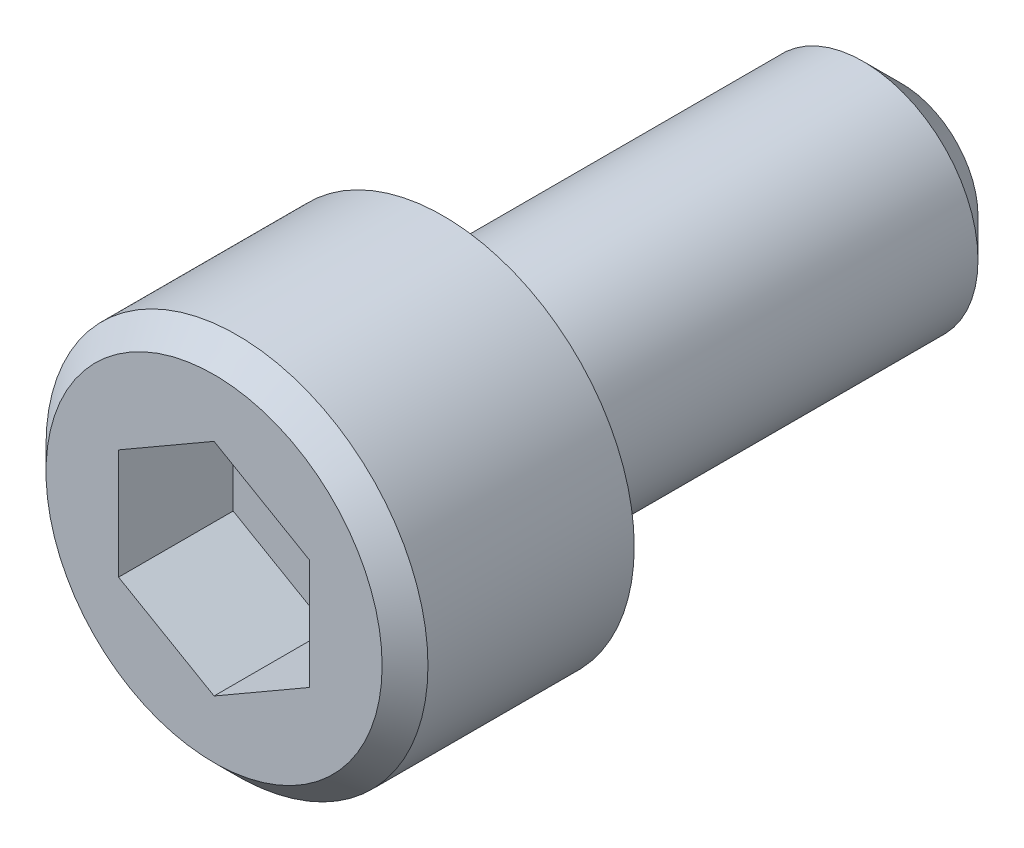
ISO-10303-21;
HEADER;
FILE_DESCRIPTION(('STEP AP214'),'2;1');
FILE_NAME('part.step','',(''),(''),'','','');
FILE_SCHEMA(('AUTOMOTIVE_DESIGN { 1 0 10303 214 1 1 1 1 }'));
ENDSEC;
DATA;
#1=APPLICATION_CONTEXT('core data for automotive mechanical design processes');
#2=APPLICATION_PROTOCOL_DEFINITION('international standard','automotive_design',2000,#1);
#3=PRODUCT_CONTEXT('',#1,'mechanical');
#4=PRODUCT('Part','Part','',(#3));
#5=PRODUCT_RELATED_PRODUCT_CATEGORY('part','',(#4));
#6=PRODUCT_DEFINITION_FORMATION('','',#4);
#7=PRODUCT_DEFINITION_CONTEXT('part definition',#1,'design');
#8=PRODUCT_DEFINITION('design','',#6,#7);
#9=PRODUCT_DEFINITION_SHAPE('','',#8);
#10=(LENGTH_UNIT() NAMED_UNIT(*) SI_UNIT(.MILLI.,.METRE.));
#11=(NAMED_UNIT(*) PLANE_ANGLE_UNIT() SI_UNIT($,.RADIAN.));
#12=(NAMED_UNIT(*) SI_UNIT($,.STERADIAN.) SOLID_ANGLE_UNIT());
#13=UNCERTAINTY_MEASURE_WITH_UNIT(LENGTH_MEASURE(1.E-05),#10,'distance_accuracy_value','');
#14=(GEOMETRIC_REPRESENTATION_CONTEXT(3) GLOBAL_UNCERTAINTY_ASSIGNED_CONTEXT((#13)) GLOBAL_UNIT_ASSIGNED_CONTEXT((#10,
#11,#12)) REPRESENTATION_CONTEXT('',''));
#15=CARTESIAN_POINT('',(0.,0.,0.));
#16=DIRECTION('',(0.,0.,1.));
#17=DIRECTION('',(1.,0.,0.));
#18=AXIS2_PLACEMENT_3D('',#15,#16,#17);
#19=CARTESIAN_POINT('',(0.,0.,6.));
#20=DIRECTION('',(0.,0.,1.));
#21=DIRECTION('',(1.,0.,0.));
#22=AXIS2_PLACEMENT_3D('',#19,#20,#21);
#23=PLANE('',#22);
#24=CARTESIAN_POINT('',(0.,0.,6.));
#25=DIRECTION('',(0.,0.,1.));
#26=DIRECTION('',(1.,0.,0.));
#27=AXIS2_PLACEMENT_3D('',#24,#25,#26);
#28=CIRCLE('',#27,4.4);
#29=CARTESIAN_POINT('',(4.4,0.,6.));
#30=VERTEX_POINT('',#29);
#31=EDGE_CURVE('E9',#30,#30,#28,.T.);
#32=ORIENTED_EDGE('',*,*,#31,.T.);
#33=EDGE_LOOP('',(#32));
#34=FACE_BOUND('',#33,.T.);
#35=DIRECTION('',(0.,-1.,0.));
#36=VECTOR('',#35,1.);
#37=CARTESIAN_POINT('',(2.5,1.44337567297406,6.));
#38=LINE('',#37,#36);
#39=CARTESIAN_POINT('',(2.5,1.44337567297406,6.));
#40=VERTEX_POINT('',#39);
#41=CARTESIAN_POINT('',(2.5,-1.44337567297406,6.));
#42=VERTEX_POINT('',#41);
#43=EDGE_CURVE('E101',#40,#42,#38,.T.);
#44=ORIENTED_EDGE('',*,*,#43,.T.);
#45=DIRECTION('',(-0.866025403784439,-0.5,0.));
#46=VECTOR('',#45,1.);
#47=CARTESIAN_POINT('',(2.5,-1.44337567297406,6.));
#48=LINE('',#47,#46);
#49=CARTESIAN_POINT('',(0.,-2.88675134594813,6.));
#50=VERTEX_POINT('',#49);
#51=EDGE_CURVE('E29',#42,#50,#48,.T.);
#52=ORIENTED_EDGE('',*,*,#51,.T.);
#53=DIRECTION('',(-0.866025403784438,0.5,0.));
#54=VECTOR('',#53,1.);
#55=CARTESIAN_POINT('',(0.,-2.88675134594813,6.));
#56=LINE('',#55,#54);
#57=CARTESIAN_POINT('',(-2.49999999999999,-1.44337567297406,6.));
#58=VERTEX_POINT('',#57);
#59=EDGE_CURVE('E102',#50,#58,#56,.T.);
#60=ORIENTED_EDGE('',*,*,#59,.T.);
#61=DIRECTION('',(0.,1.,0.));
#62=VECTOR('',#61,1.);
#63=CARTESIAN_POINT('',(-2.5,-1.44337567297406,6.));
#64=LINE('',#63,#62);
#65=CARTESIAN_POINT('',(-2.5,1.44337567297406,6.));
#66=VERTEX_POINT('',#65);
#67=EDGE_CURVE('E106',#58,#66,#64,.T.);
#68=ORIENTED_EDGE('',*,*,#67,.T.);
#69=DIRECTION('',(0.866025403784439,0.5,0.));
#70=VECTOR('',#69,1.);
#71=CARTESIAN_POINT('',(-2.49999999999999,1.44337567297406,6.));
#72=LINE('',#71,#70);
#73=CARTESIAN_POINT('',(0.,2.88675134594813,6.));
#74=VERTEX_POINT('',#73);
#75=EDGE_CURVE('E110',#66,#74,#72,.T.);
#76=ORIENTED_EDGE('',*,*,#75,.T.);
#77=DIRECTION('',(0.866025403784438,-0.5,0.));
#78=VECTOR('',#77,1.);
#79=CARTESIAN_POINT('',(0.,2.88675134594813,6.));
#80=LINE('',#79,#78);
#81=EDGE_CURVE('E90',#74,#40,#80,.T.);
#82=ORIENTED_EDGE('',*,*,#81,.T.);
#83=EDGE_LOOP('',(#44,#52,#60,#68,#76,#82));
#84=FACE_BOUND('',#83,.T.);
#85=ADVANCED_FACE('F15',(#34,#84),#23,.T.);
#86=CARTESIAN_POINT('',(0.,0.,6.));
#87=DIRECTION('',(0.,0.,-1.));
#88=DIRECTION('',(-1.,0.,0.));
#89=AXIS2_PLACEMENT_3D('',#86,#87,#88);
#90=CONICAL_SURFACE('',#89,4.4,0.785398163397451);
#91=CARTESIAN_POINT('',(0.,0.,5.4));
#92=DIRECTION('',(0.,0.,1.));
#93=DIRECTION('',(1.,0.,0.));
#94=AXIS2_PLACEMENT_3D('',#91,#92,#93);
#95=CIRCLE('',#94,5.);
#96=CARTESIAN_POINT('',(5.,0.,5.4));
#97=VERTEX_POINT('',#96);
#98=EDGE_CURVE('E22',#97,#97,#95,.T.);
#99=ORIENTED_EDGE('',*,*,#98,.T.);
#100=EDGE_LOOP('',(#99));
#101=FACE_BOUND('',#100,.T.);
#102=ORIENTED_EDGE('',*,*,#31,.F.);
#103=EDGE_LOOP('',(#102));
#104=FACE_BOUND('',#103,.T.);
#105=ADVANCED_FACE('F141',(#101,#104),#90,.T.);
#106=CARTESIAN_POINT('',(0.,0.,54.));
#107=DIRECTION('',(0.,0.,1.));
#108=DIRECTION('',(1.,0.,0.));
#109=AXIS2_PLACEMENT_3D('',#106,#107,#108);
#110=CYLINDRICAL_SURFACE('',#109,5.);
#111=CARTESIAN_POINT('',(0.,0.,0.));
#112=DIRECTION('',(0.,0.,1.));
#113=DIRECTION('',(1.,0.,0.));
#114=AXIS2_PLACEMENT_3D('',#111,#112,#113);
#115=CIRCLE('',#114,5.);
#116=CARTESIAN_POINT('',(5.,0.,0.));
#117=VERTEX_POINT('',#116);
#118=EDGE_CURVE('E136',#117,#117,#115,.T.);
#119=ORIENTED_EDGE('',*,*,#118,.T.);
#120=EDGE_LOOP('',(#119));
#121=FACE_BOUND('',#120,.T.);
#122=ORIENTED_EDGE('',*,*,#98,.F.);
#123=EDGE_LOOP('',(#122));
#124=FACE_BOUND('',#123,.T.);
#125=ADVANCED_FACE('F144',(#121,#124),#110,.T.);
#126=CARTESIAN_POINT('',(5.,0.,0.));
#127=DIRECTION('',(0.,0.,-1.));
#128=DIRECTION('',(-1.,0.,0.));
#129=AXIS2_PLACEMENT_3D('',#126,#127,#128);
#130=PLANE('',#129);
#131=CARTESIAN_POINT('',(0.,0.,0.));
#132=DIRECTION('',(0.,0.,1.));
#133=DIRECTION('',(1.,0.,0.));
#134=AXIS2_PLACEMENT_3D('',#131,#132,#133);
#135=CIRCLE('',#134,3.);
#136=CARTESIAN_POINT('',(3.,0.,0.));
#137=VERTEX_POINT('',#136);
#138=EDGE_CURVE('E133',#137,#137,#135,.T.);
#139=ORIENTED_EDGE('',*,*,#138,.T.);
#140=EDGE_LOOP('',(#139));
#141=FACE_BOUND('',#140,.T.);
#142=ORIENTED_EDGE('',*,*,#118,.F.);
#143=EDGE_LOOP('',(#142));
#144=FACE_BOUND('',#143,.T.);
#145=ADVANCED_FACE('F146',(#141,#144),#130,.T.);
#146=CARTESIAN_POINT('',(0.,0.,54.));
#147=DIRECTION('',(0.,0.,1.));
#148=DIRECTION('',(1.,0.,0.));
#149=AXIS2_PLACEMENT_3D('',#146,#147,#148);
#150=CYLINDRICAL_SURFACE('',#149,3.);
#151=CARTESIAN_POINT('',(0.,0.,-11.));
#152=DIRECTION('',(0.,0.,1.));
#153=DIRECTION('',(1.,0.,0.));
#154=AXIS2_PLACEMENT_3D('',#151,#152,#153);
#155=CIRCLE('',#154,3.);
#156=CARTESIAN_POINT('',(3.,0.,-11.));
#157=VERTEX_POINT('',#156);
#158=EDGE_CURVE('E130',#157,#157,#155,.T.);
#159=ORIENTED_EDGE('',*,*,#158,.T.);
#160=EDGE_LOOP('',(#159));
#161=FACE_BOUND('',#160,.T.);
#162=ORIENTED_EDGE('',*,*,#138,.F.);
#163=EDGE_LOOP('',(#162));
#164=FACE_BOUND('',#163,.T.);
#165=ADVANCED_FACE('F154',(#161,#164),#150,.T.);
#166=CARTESIAN_POINT('',(0.,0.,-11.));
#167=DIRECTION('',(0.,0.,1.));
#168=DIRECTION('',(1.,0.,0.));
#169=AXIS2_PLACEMENT_3D('',#166,#167,#168);
#170=CONICAL_SURFACE('',#169,3.,0.785398163397448);
#171=CARTESIAN_POINT('',(0.,0.,-12.));
#172=DIRECTION('',(0.,0.,1.));
#173=DIRECTION('',(1.,0.,0.));
#174=AXIS2_PLACEMENT_3D('',#171,#172,#173);
#175=CIRCLE('',#174,2.);
#176=CARTESIAN_POINT('',(2.,0.,-12.));
#177=VERTEX_POINT('',#176);
#178=EDGE_CURVE('E127',#177,#177,#175,.T.);
#179=ORIENTED_EDGE('',*,*,#178,.T.);
#180=EDGE_LOOP('',(#179));
#181=FACE_BOUND('',#180,.T.);
#182=ORIENTED_EDGE('',*,*,#158,.F.);
#183=EDGE_LOOP('',(#182));
#184=FACE_BOUND('',#183,.T.);
#185=ADVANCED_FACE('F188',(#181,#184),#170,.T.);
#186=CARTESIAN_POINT('',(2.,0.,-12.));
#187=DIRECTION('',(0.,0.,-1.));
#188=DIRECTION('',(-1.,0.,0.));
#189=AXIS2_PLACEMENT_3D('',#186,#187,#188);
#190=PLANE('',#189);
#191=ORIENTED_EDGE('',*,*,#178,.F.);
#192=EDGE_LOOP('',(#191));
#193=FACE_BOUND('',#192,.T.);
#194=ADVANCED_FACE('F185',(#193),#190,.T.);
#195=CARTESIAN_POINT('',(2.5,-1.44337567297406,3.));
#196=DIRECTION('',(-0.5,0.866025403784438,0.));
#197=DIRECTION('',(-0.866025403784439,-0.5,0.));
#198=AXIS2_PLACEMENT_3D('',#195,#196,#197);
#199=PLANE('',#198);
#200=ORIENTED_EDGE('',*,*,#51,.F.);
#201=DIRECTION('',(0.,0.,1.));
#202=VECTOR('',#201,1.);
#203=CARTESIAN_POINT('',(2.5,-1.44337567297406,3.));
#204=LINE('',#203,#202);
#205=CARTESIAN_POINT('',(2.5,-1.44337567297406,3.));
#206=VERTEX_POINT('',#205);
#207=EDGE_CURVE('E95',#206,#42,#204,.T.);
#208=ORIENTED_EDGE('',*,*,#207,.F.);
#209=DIRECTION('',(-0.866025403784439,-0.5,0.));
#210=VECTOR('',#209,1.);
#211=CARTESIAN_POINT('',(2.5,-1.44337567297406,3.));
#212=LINE('',#211,#210);
#213=CARTESIAN_POINT('',(0.,-2.88675134594813,3.));
#214=VERTEX_POINT('',#213);
#215=EDGE_CURVE('E99',#206,#214,#212,.T.);
#216=ORIENTED_EDGE('',*,*,#215,.T.);
#217=DIRECTION('',(0.,0.,1.));
#218=VECTOR('',#217,1.);
#219=CARTESIAN_POINT('',(0.,-2.88675134594813,3.));
#220=LINE('',#219,#218);
#221=EDGE_CURVE('E125',#214,#50,#220,.T.);
#222=ORIENTED_EDGE('',*,*,#221,.T.);
#223=EDGE_LOOP('',(#200,#208,#216,#222));
#224=FACE_BOUND('',#223,.T.);
#225=ADVANCED_FACE('F164',(#224),#199,.T.);
#226=CARTESIAN_POINT('',(0.,-2.88675134594813,3.));
#227=DIRECTION('',(0.5,0.866025403784438,0.));
#228=DIRECTION('',(-0.866025403784438,0.5,0.));
#229=AXIS2_PLACEMENT_3D('',#226,#227,#228);
#230=PLANE('',#229);
#231=ORIENTED_EDGE('',*,*,#59,.F.);
#232=ORIENTED_EDGE('',*,*,#221,.F.);
#233=DIRECTION('',(-0.866025403784438,0.5,0.));
#234=VECTOR('',#233,1.);
#235=CARTESIAN_POINT('',(0.,-2.88675134594813,3.));
#236=LINE('',#235,#234);
#237=CARTESIAN_POINT('',(-2.49999999999999,-1.44337567297406,3.));
#238=VERTEX_POINT('',#237);
#239=EDGE_CURVE('E68',#214,#238,#236,.T.);
#240=ORIENTED_EDGE('',*,*,#239,.T.);
#241=DIRECTION('',(0.,0.,1.));
#242=VECTOR('',#241,1.);
#243=CARTESIAN_POINT('',(-2.49999999999999,-1.44337567297406,3.));
#244=LINE('',#243,#242);
#245=EDGE_CURVE('E123',#238,#58,#244,.T.);
#246=ORIENTED_EDGE('',*,*,#245,.T.);
#247=EDGE_LOOP('',(#231,#232,#240,#246));
#248=FACE_BOUND('',#247,.T.);
#249=ADVANCED_FACE('F167',(#248),#230,.T.);
#250=CARTESIAN_POINT('',(-2.5,-1.44337567297406,3.));
#251=DIRECTION('',(1.,0.,0.));
#252=DIRECTION('',(0.,0.,-1.));
#253=AXIS2_PLACEMENT_3D('',#250,#251,#252);
#254=PLANE('',#253);
#255=ORIENTED_EDGE('',*,*,#67,.F.);
#256=ORIENTED_EDGE('',*,*,#245,.F.);
#257=DIRECTION('',(0.,1.,0.));
#258=VECTOR('',#257,1.);
#259=CARTESIAN_POINT('',(-2.5,-1.44337567297406,3.));
#260=LINE('',#259,#258);
#261=CARTESIAN_POINT('',(-2.5,1.44337567297406,3.));
#262=VERTEX_POINT('',#261);
#263=EDGE_CURVE('E86',#238,#262,#260,.T.);
#264=ORIENTED_EDGE('',*,*,#263,.T.);
#265=DIRECTION('',(0.,0.,1.));
#266=VECTOR('',#265,1.);
#267=CARTESIAN_POINT('',(-2.5,1.44337567297406,3.));
#268=LINE('',#267,#266);
#269=EDGE_CURVE('E83',#262,#66,#268,.T.);
#270=ORIENTED_EDGE('',*,*,#269,.T.);
#271=EDGE_LOOP('',(#255,#256,#264,#270));
#272=FACE_BOUND('',#271,.T.);
#273=ADVANCED_FACE('F171',(#272),#254,.T.);
#274=CARTESIAN_POINT('',(-2.49999999999999,1.44337567297406,3.));
#275=DIRECTION('',(0.5,-0.866025403784438,0.));
#276=DIRECTION('',(0.866025403784439,0.5,0.));
#277=AXIS2_PLACEMENT_3D('',#274,#275,#276);
#278=PLANE('',#277);
#279=ORIENTED_EDGE('',*,*,#75,.F.);
#280=ORIENTED_EDGE('',*,*,#269,.F.);
#281=DIRECTION('',(0.866025403784439,0.5,0.));
#282=VECTOR('',#281,1.);
#283=CARTESIAN_POINT('',(-2.49999999999999,1.44337567297406,3.));
#284=LINE('',#283,#282);
#285=CARTESIAN_POINT('',(0.,2.88675134594813,3.));
#286=VERTEX_POINT('',#285);
#287=EDGE_CURVE('E78',#262,#286,#284,.T.);
#288=ORIENTED_EDGE('',*,*,#287,.T.);
#289=DIRECTION('',(0.,0.,1.));
#290=VECTOR('',#289,1.);
#291=CARTESIAN_POINT('',(0.,2.88675134594813,3.));
#292=LINE('',#291,#290);
#293=EDGE_CURVE('E82',#286,#74,#292,.T.);
#294=ORIENTED_EDGE('',*,*,#293,.T.);
#295=EDGE_LOOP('',(#279,#280,#288,#294));
#296=FACE_BOUND('',#295,.T.);
#297=ADVANCED_FACE('F81',(#296),#278,.T.);
#298=CARTESIAN_POINT('',(0.,2.88675134594813,3.));
#299=DIRECTION('',(-0.5,-0.866025403784438,0.));
#300=DIRECTION('',(0.866025403784439,-0.5,0.));
#301=AXIS2_PLACEMENT_3D('',#298,#299,#300);
#302=PLANE('',#301);
#303=ORIENTED_EDGE('',*,*,#81,.F.);
#304=ORIENTED_EDGE('',*,*,#293,.F.);
#305=DIRECTION('',(0.866025403784438,-0.5,0.));
#306=VECTOR('',#305,1.);
#307=CARTESIAN_POINT('',(0.,2.88675134594813,3.));
#308=LINE('',#307,#306);
#309=CARTESIAN_POINT('',(2.5,1.44337567297406,3.));
#310=VERTEX_POINT('',#309);
#311=EDGE_CURVE('E85',#286,#310,#308,.T.);
#312=ORIENTED_EDGE('',*,*,#311,.T.);
#313=DIRECTION('',(0.,0.,1.));
#314=VECTOR('',#313,1.);
#315=CARTESIAN_POINT('',(2.5,1.44337567297406,3.));
#316=LINE('',#315,#314);
#317=EDGE_CURVE('E59',#310,#40,#316,.T.);
#318=ORIENTED_EDGE('',*,*,#317,.T.);
#319=EDGE_LOOP('',(#303,#304,#312,#318));
#320=FACE_BOUND('',#319,.T.);
#321=ADVANCED_FACE('F88',(#320),#302,.T.);
#322=CARTESIAN_POINT('',(2.5,1.44337567297406,3.));
#323=DIRECTION('',(-1.,0.,0.));
#324=DIRECTION('',(0.,0.,1.));
#325=AXIS2_PLACEMENT_3D('',#322,#323,#324);
#326=PLANE('',#325);
#327=ORIENTED_EDGE('',*,*,#43,.F.);
#328=ORIENTED_EDGE('',*,*,#317,.F.);
#329=DIRECTION('',(0.,-1.,0.));
#330=VECTOR('',#329,1.);
#331=CARTESIAN_POINT('',(2.5,1.44337567297406,3.));
#332=LINE('',#331,#330);
#333=EDGE_CURVE('E37',#310,#206,#332,.T.);
#334=ORIENTED_EDGE('',*,*,#333,.T.);
#335=ORIENTED_EDGE('',*,*,#207,.T.);
#336=EDGE_LOOP('',(#327,#328,#334,#335));
#337=FACE_BOUND('',#336,.T.);
#338=ADVANCED_FACE('F163',(#337),#326,.T.);
#339=CARTESIAN_POINT('',(0.,-2.88675134594813,3.));
#340=DIRECTION('',(0.,0.,-1.));
#341=DIRECTION('',(-1.,0.,0.));
#342=AXIS2_PLACEMENT_3D('',#339,#340,#341);
#343=PLANE('',#342);
#344=ORIENTED_EDGE('',*,*,#215,.F.);
#345=ORIENTED_EDGE('',*,*,#333,.F.);
#346=ORIENTED_EDGE('',*,*,#311,.F.);
#347=ORIENTED_EDGE('',*,*,#287,.F.);
#348=ORIENTED_EDGE('',*,*,#263,.F.);
#349=ORIENTED_EDGE('',*,*,#239,.F.);
#350=EDGE_LOOP('',(#344,#345,#346,#347,#348,#349));
#351=FACE_BOUND('',#350,.T.);
#352=ADVANCED_FACE('F93',(#351),#343,.F.);
#353=CLOSED_SHELL('',(#85,#105,#125,#145,#165,#185,#194,#225,#249,#273,#297,#321,#338,#352));
#354=MANIFOLD_SOLID_BREP('B1',#353);
#355=ADVANCED_BREP_SHAPE_REPRESENTATION('',(#18,#354),#14);
#356=SHAPE_DEFINITION_REPRESENTATION(#9,#355);
ENDSEC;
END-ISO-10303-21;
